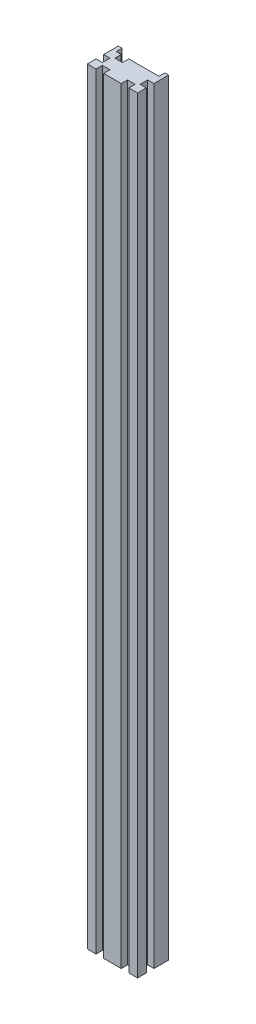
ISO-10303-21;
HEADER;
FILE_DESCRIPTION(('STEP AP214'),'2;1');
FILE_NAME('part.step','',(''),(''),'','','');
FILE_SCHEMA(('AUTOMOTIVE_DESIGN { 1 0 10303 214 1 1 1 1 }'));
ENDSEC;
DATA;
#1=APPLICATION_CONTEXT('core data for automotive mechanical design processes');
#2=APPLICATION_PROTOCOL_DEFINITION('international standard','automotive_design',2000,#1);
#3=PRODUCT_CONTEXT('',#1,'mechanical');
#4=PRODUCT('Part','Part','',(#3));
#5=PRODUCT_RELATED_PRODUCT_CATEGORY('part','',(#4));
#6=PRODUCT_DEFINITION_FORMATION('','',#4);
#7=PRODUCT_DEFINITION_CONTEXT('part definition',#1,'design');
#8=PRODUCT_DEFINITION('design','',#6,#7);
#9=PRODUCT_DEFINITION_SHAPE('','',#8);
#10=(LENGTH_UNIT() NAMED_UNIT(*) SI_UNIT(.MILLI.,.METRE.));
#11=(NAMED_UNIT(*) PLANE_ANGLE_UNIT() SI_UNIT($,.RADIAN.));
#12=(NAMED_UNIT(*) SI_UNIT($,.STERADIAN.) SOLID_ANGLE_UNIT());
#13=UNCERTAINTY_MEASURE_WITH_UNIT(LENGTH_MEASURE(1.E-05),#10,'distance_accuracy_value','');
#14=(GEOMETRIC_REPRESENTATION_CONTEXT(3) GLOBAL_UNCERTAINTY_ASSIGNED_CONTEXT((#13)) GLOBAL_UNIT_ASSIGNED_CONTEXT((#10,
#11,#12)) REPRESENTATION_CONTEXT('',''));
#15=CARTESIAN_POINT('',(0.,0.,0.));
#16=DIRECTION('',(0.,0.,1.));
#17=DIRECTION('',(1.,0.,0.));
#18=AXIS2_PLACEMENT_3D('',#15,#16,#17);
#19=CARTESIAN_POINT('',(0.,609.6,-20.));
#20=DIRECTION('',(0.,0.,1.));
#21=DIRECTION('',(1.,0.,0.));
#22=AXIS2_PLACEMENT_3D('',#19,#20,#21);
#23=PLANE('',#22);
#24=DIRECTION('',(0.,-1.,0.));
#25=VECTOR('',#24,1.);
#26=CARTESIAN_POINT('',(3.,609.6,-20.));
#27=LINE('',#26,#25);
#28=CARTESIAN_POINT('',(3.,609.6,-20.));
#29=VERTEX_POINT('',#28);
#30=CARTESIAN_POINT('',(3.,0.,-20.));
#31=VERTEX_POINT('',#30);
#32=EDGE_CURVE('E61',#29,#31,#27,.T.);
#33=ORIENTED_EDGE('',*,*,#32,.F.);
#34=DIRECTION('',(-1.,0.,0.));
#35=VECTOR('',#34,1.);
#36=CARTESIAN_POINT('',(0.,609.6,-20.));
#37=LINE('',#36,#35);
#38=CARTESIAN_POINT('',(7.,609.6,-20.));
#39=VERTEX_POINT('',#38);
#40=EDGE_CURVE('E486',#39,#29,#37,.T.);
#41=ORIENTED_EDGE('',*,*,#40,.F.);
#42=DIRECTION('',(0.,1.,0.));
#43=VECTOR('',#42,1.);
#44=CARTESIAN_POINT('',(7.,609.6,-20.));
#45=LINE('',#44,#43);
#46=CARTESIAN_POINT('',(6.99999999999993,0.,-20.));
#47=VERTEX_POINT('',#46);
#48=EDGE_CURVE('E297',#47,#39,#45,.T.);
#49=ORIENTED_EDGE('',*,*,#48,.F.);
#50=DIRECTION('',(-1.,0.,0.));
#51=VECTOR('',#50,1.);
#52=CARTESIAN_POINT('',(0.,0.,-20.));
#53=LINE('',#52,#51);
#54=EDGE_CURVE('E66',#47,#31,#53,.T.);
#55=ORIENTED_EDGE('',*,*,#54,.T.);
#56=EDGE_LOOP('',(#33,#41,#49,#55));
#57=FACE_BOUND('',#56,.T.);
#58=ADVANCED_FACE('F45',(#57),#23,.F.);
#59=DIRECTION('',(0.,1.,0.));
#60=VECTOR('',#59,1.);
#61=CARTESIAN_POINT('',(37.,0.,-20.));
#62=LINE('',#61,#60);
#63=CARTESIAN_POINT('',(37.,0.,-20.));
#64=VERTEX_POINT('',#63);
#65=CARTESIAN_POINT('',(37.,609.6,-20.));
#66=VERTEX_POINT('',#65);
#67=EDGE_CURVE('E267',#64,#66,#62,.T.);
#68=ORIENTED_EDGE('',*,*,#67,.F.);
#69=CARTESIAN_POINT('',(12.9999999999999,0.,-20.));
#70=VERTEX_POINT('',#69);
#71=EDGE_CURVE('E500',#64,#70,#53,.T.);
#72=ORIENTED_EDGE('',*,*,#71,.T.);
#73=DIRECTION('',(0.,-1.,0.));
#74=VECTOR('',#73,1.);
#75=CARTESIAN_POINT('',(13.,609.6,-20.));
#76=LINE('',#75,#74);
#77=CARTESIAN_POINT('',(13.,609.6,-20.));
#78=VERTEX_POINT('',#77);
#79=EDGE_CURVE('E303',#78,#70,#76,.T.);
#80=ORIENTED_EDGE('',*,*,#79,.F.);
#81=EDGE_CURVE('E487',#66,#78,#37,.T.);
#82=ORIENTED_EDGE('',*,*,#81,.F.);
#83=EDGE_LOOP('',(#68,#72,#80,#82));
#84=FACE_BOUND('',#83,.T.);
#85=ADVANCED_FACE('F585',(#84),#23,.F.);
#86=CARTESIAN_POINT('',(40.,609.6,0.));
#87=DIRECTION('',(-1.,0.,0.));
#88=DIRECTION('',(0.,0.,1.));
#89=AXIS2_PLACEMENT_3D('',#86,#87,#88);
#90=PLANE('',#89);
#91=DIRECTION('',(0.,0.,-1.));
#92=VECTOR('',#91,1.);
#93=CARTESIAN_POINT('',(40.,0.,0.));
#94=LINE('',#93,#92);
#95=CARTESIAN_POINT('',(40.,0.,0.));
#96=VERTEX_POINT('',#95);
#97=CARTESIAN_POINT('',(40.,0.,-7.00000000000008));
#98=VERTEX_POINT('',#97);
#99=EDGE_CURVE('E496',#96,#98,#94,.T.);
#100=ORIENTED_EDGE('',*,*,#99,.T.);
#101=DIRECTION('',(0.,-1.,0.));
#102=VECTOR('',#101,1.);
#103=CARTESIAN_POINT('',(40.,609.6,-7.));
#104=LINE('',#103,#102);
#105=CARTESIAN_POINT('',(40.,609.6,-7.));
#106=VERTEX_POINT('',#105);
#107=EDGE_CURVE('E323',#106,#98,#104,.T.);
#108=ORIENTED_EDGE('',*,*,#107,.F.);
#109=DIRECTION('',(0.,0.,-1.));
#110=VECTOR('',#109,1.);
#111=CARTESIAN_POINT('',(40.,609.6,0.));
#112=LINE('',#111,#110);
#113=CARTESIAN_POINT('',(40.,609.6,0.));
#114=VERTEX_POINT('',#113);
#115=EDGE_CURVE('E482',#114,#106,#112,.T.);
#116=ORIENTED_EDGE('',*,*,#115,.F.);
#117=DIRECTION('',(0.,-1.,0.));
#118=VECTOR('',#117,1.);
#119=CARTESIAN_POINT('',(40.,609.6,0.));
#120=LINE('',#119,#118);
#121=EDGE_CURVE('E54',#114,#96,#120,.T.);
#122=ORIENTED_EDGE('',*,*,#121,.T.);
#123=EDGE_LOOP('',(#100,#108,#116,#122));
#124=FACE_BOUND('',#123,.T.);
#125=ADVANCED_FACE('F508',(#124),#90,.F.);
#126=CARTESIAN_POINT('',(0.,609.6,0.));
#127=DIRECTION('',(1.,0.,0.));
#128=DIRECTION('',(0.,0.,-1.));
#129=AXIS2_PLACEMENT_3D('',#126,#127,#128);
#130=PLANE('',#129);
#131=DIRECTION('',(0.,0.,1.));
#132=VECTOR('',#131,1.);
#133=CARTESIAN_POINT('',(0.,0.,0.));
#134=LINE('',#133,#132);
#135=CARTESIAN_POINT('',(0.,0.,-24.75));
#136=VERTEX_POINT('',#135);
#137=CARTESIAN_POINT('',(0.,0.,-12.9999999999999));
#138=VERTEX_POINT('',#137);
#139=EDGE_CURVE('E232',#136,#138,#134,.T.);
#140=ORIENTED_EDGE('',*,*,#139,.T.);
#141=DIRECTION('',(0.,-1.,0.));
#142=VECTOR('',#141,1.);
#143=CARTESIAN_POINT('',(0.,609.6,-13.));
#144=LINE('',#143,#142);
#145=CARTESIAN_POINT('',(0.,609.6,-13.));
#146=VERTEX_POINT('',#145);
#147=EDGE_CURVE('E359',#146,#138,#144,.T.);
#148=ORIENTED_EDGE('',*,*,#147,.F.);
#149=DIRECTION('',(0.,0.,1.));
#150=VECTOR('',#149,1.);
#151=CARTESIAN_POINT('',(0.,609.6,0.));
#152=LINE('',#151,#150);
#153=CARTESIAN_POINT('',(0.,609.6,-24.75));
#154=VERTEX_POINT('',#153);
#155=EDGE_CURVE('E260',#154,#146,#152,.T.);
#156=ORIENTED_EDGE('',*,*,#155,.F.);
#157=DIRECTION('',(0.,1.,0.));
#158=VECTOR('',#157,1.);
#159=CARTESIAN_POINT('',(0.,609.6,-24.75));
#160=LINE('',#159,#158);
#161=EDGE_CURVE('E251',#136,#154,#160,.T.);
#162=ORIENTED_EDGE('',*,*,#161,.F.);
#163=EDGE_LOOP('',(#140,#148,#156,#162));
#164=FACE_BOUND('',#163,.T.);
#165=ADVANCED_FACE('F258',(#164),#130,.F.);
#166=CARTESIAN_POINT('',(0.,609.6,0.));
#167=DIRECTION('',(0.,0.,-1.));
#168=DIRECTION('',(-1.,0.,0.));
#169=AXIS2_PLACEMENT_3D('',#166,#167,#168);
#170=PLANE('',#169);
#171=DIRECTION('',(1.,0.,0.));
#172=VECTOR('',#171,1.);
#173=CARTESIAN_POINT('',(0.,0.,0.));
#174=LINE('',#173,#172);
#175=CARTESIAN_POINT('',(0.,0.,0.));
#176=VERTEX_POINT('',#175);
#177=CARTESIAN_POINT('',(7.00000000000007,0.,0.));
#178=VERTEX_POINT('',#177);
#179=EDGE_CURVE('E490',#176,#178,#174,.T.);
#180=ORIENTED_EDGE('',*,*,#179,.T.);
#181=DIRECTION('',(0.,-1.,0.));
#182=VECTOR('',#181,1.);
#183=CARTESIAN_POINT('',(7.,609.6,0.));
#184=LINE('',#183,#182);
#185=CARTESIAN_POINT('',(7.,609.6,0.));
#186=VERTEX_POINT('',#185);
#187=EDGE_CURVE('E420',#186,#178,#184,.T.);
#188=ORIENTED_EDGE('',*,*,#187,.F.);
#189=DIRECTION('',(1.,0.,0.));
#190=VECTOR('',#189,1.);
#191=CARTESIAN_POINT('',(0.,609.6,0.));
#192=LINE('',#191,#190);
#193=CARTESIAN_POINT('',(0.,609.6,0.));
#194=VERTEX_POINT('',#193);
#195=EDGE_CURVE('E476',#194,#186,#192,.T.);
#196=ORIENTED_EDGE('',*,*,#195,.F.);
#197=DIRECTION('',(0.,-1.,0.));
#198=VECTOR('',#197,1.);
#199=CARTESIAN_POINT('',(0.,609.6,0.));
#200=LINE('',#199,#198);
#201=EDGE_CURVE('E11',#194,#176,#200,.T.);
#202=ORIENTED_EDGE('',*,*,#201,.T.);
#203=EDGE_LOOP('',(#180,#188,#196,#202));
#204=FACE_BOUND('',#203,.T.);
#205=ADVANCED_FACE('F562',(#204),#170,.F.);
#206=CARTESIAN_POINT('',(13.,609.6,0.));
#207=VERTEX_POINT('',#206);
#208=CARTESIAN_POINT('',(27.,609.6,0.));
#209=VERTEX_POINT('',#208);
#210=EDGE_CURVE('E481',#207,#209,#192,.T.);
#211=ORIENTED_EDGE('',*,*,#210,.F.);
#212=DIRECTION('',(0.,1.,0.));
#213=VECTOR('',#212,1.);
#214=CARTESIAN_POINT('',(13.,609.6,0.));
#215=LINE('',#214,#213);
#216=CARTESIAN_POINT('',(13.,0.,0.));
#217=VERTEX_POINT('',#216);
#218=EDGE_CURVE('E407',#217,#207,#215,.T.);
#219=ORIENTED_EDGE('',*,*,#218,.F.);
#220=CARTESIAN_POINT('',(27.,0.,0.));
#221=VERTEX_POINT('',#220);
#222=EDGE_CURVE('E495',#217,#221,#174,.T.);
#223=ORIENTED_EDGE('',*,*,#222,.T.);
#224=DIRECTION('',(0.,-1.,0.));
#225=VECTOR('',#224,1.);
#226=CARTESIAN_POINT('',(27.,0.,0.));
#227=LINE('',#226,#225);
#228=EDGE_CURVE('E423',#209,#221,#227,.T.);
#229=ORIENTED_EDGE('',*,*,#228,.F.);
#230=EDGE_LOOP('',(#211,#219,#223,#229));
#231=FACE_BOUND('',#230,.T.);
#232=ADVANCED_FACE('F535',(#231),#170,.F.);
#233=CARTESIAN_POINT('',(0.,609.6,-7.));
#234=VERTEX_POINT('',#233);
#235=EDGE_CURVE('E475',#234,#194,#152,.T.);
#236=ORIENTED_EDGE('',*,*,#235,.F.);
#237=DIRECTION('',(0.,1.,0.));
#238=VECTOR('',#237,1.);
#239=CARTESIAN_POINT('',(0.,609.6,-7.));
#240=LINE('',#239,#238);
#241=CARTESIAN_POINT('',(0.,0.,-6.99999999999993));
#242=VERTEX_POINT('',#241);
#243=EDGE_CURVE('E374',#242,#234,#240,.T.);
#244=ORIENTED_EDGE('',*,*,#243,.F.);
#245=EDGE_CURVE('E246',#242,#176,#134,.T.);
#246=ORIENTED_EDGE('',*,*,#245,.T.);
#247=ORIENTED_EDGE('',*,*,#201,.F.);
#248=EDGE_LOOP('',(#236,#244,#246,#247));
#249=FACE_BOUND('',#248,.T.);
#250=ADVANCED_FACE('F47',(#249),#130,.F.);
#251=CARTESIAN_POINT('',(33.,609.6,0.));
#252=VERTEX_POINT('',#251);
#253=EDGE_CURVE('E474',#252,#114,#192,.T.);
#254=ORIENTED_EDGE('',*,*,#253,.F.);
#255=DIRECTION('',(0.,1.,0.));
#256=VECTOR('',#255,1.);
#257=CARTESIAN_POINT('',(33.,0.,0.));
#258=LINE('',#257,#256);
#259=CARTESIAN_POINT('',(33.,0.,0.));
#260=VERTEX_POINT('',#259);
#261=EDGE_CURVE('E453',#260,#252,#258,.T.);
#262=ORIENTED_EDGE('',*,*,#261,.F.);
#263=EDGE_CURVE('E245',#260,#96,#174,.T.);
#264=ORIENTED_EDGE('',*,*,#263,.T.);
#265=ORIENTED_EDGE('',*,*,#121,.F.);
#266=EDGE_LOOP('',(#254,#262,#264,#265));
#267=FACE_BOUND('',#266,.T.);
#268=ADVANCED_FACE('F547',(#267),#170,.F.);
#269=CARTESIAN_POINT('',(40.,609.6,-13.));
#270=VERTEX_POINT('',#269);
#271=CARTESIAN_POINT('',(40.,609.6,-24.75));
#272=VERTEX_POINT('',#271);
#273=EDGE_CURVE('E480',#270,#272,#112,.T.);
#274=ORIENTED_EDGE('',*,*,#273,.F.);
#275=DIRECTION('',(0.,1.,0.));
#276=VECTOR('',#275,1.);
#277=CARTESIAN_POINT('',(40.,609.6,-13.));
#278=LINE('',#277,#276);
#279=CARTESIAN_POINT('',(40.,0.,-13.0000000000001));
#280=VERTEX_POINT('',#279);
#281=EDGE_CURVE('E339',#280,#270,#278,.T.);
#282=ORIENTED_EDGE('',*,*,#281,.F.);
#283=CARTESIAN_POINT('',(40.,0.,-24.75));
#284=VERTEX_POINT('',#283);
#285=EDGE_CURVE('E494',#280,#284,#94,.T.);
#286=ORIENTED_EDGE('',*,*,#285,.T.);
#287=DIRECTION('',(0.,-1.,0.));
#288=VECTOR('',#287,1.);
#289=CARTESIAN_POINT('',(40.,0.,-24.75));
#290=LINE('',#289,#288);
#291=EDGE_CURVE('E272',#272,#284,#290,.T.);
#292=ORIENTED_EDGE('',*,*,#291,.F.);
#293=EDGE_LOOP('',(#274,#282,#286,#292));
#294=FACE_BOUND('',#293,.T.);
#295=ADVANCED_FACE('F594',(#294),#90,.F.);
#296=CARTESIAN_POINT('',(0.,609.6,0.));
#297=DIRECTION('',(0.,-1.,0.));
#298=DIRECTION('',(0.,0.,-1.));
#299=AXIS2_PLACEMENT_3D('',#296,#297,#298);
#300=PLANE('',#299);
#301=DIRECTION('',(1.,0.,0.));
#302=VECTOR('',#301,1.);
#303=CARTESIAN_POINT('',(7.,609.6,-15.));
#304=LINE('',#303,#302);
#305=CARTESIAN_POINT('',(7.,609.6,-15.));
#306=VERTEX_POINT('',#305);
#307=CARTESIAN_POINT('',(13.,609.6,-15.));
#308=VERTEX_POINT('',#307);
#309=EDGE_CURVE('E302',#306,#308,#304,.T.);
#310=ORIENTED_EDGE('',*,*,#309,.F.);
#311=DIRECTION('',(0.,0.,-1.));
#312=VECTOR('',#311,1.);
#313=CARTESIAN_POINT('',(7.,609.6,-15.));
#314=LINE('',#313,#312);
#315=EDGE_CURVE('E314',#306,#39,#314,.T.);
#316=ORIENTED_EDGE('',*,*,#315,.T.);
#317=ORIENTED_EDGE('',*,*,#40,.T.);
#318=DIRECTION('',(0.,0.,1.));
#319=VECTOR('',#318,1.);
#320=CARTESIAN_POINT('',(3.,609.6,-24.75));
#321=LINE('',#320,#319);
#322=CARTESIAN_POINT('',(3.,609.6,-24.75));
#323=VERTEX_POINT('',#322);
#324=EDGE_CURVE('E974',#323,#29,#321,.T.);
#325=ORIENTED_EDGE('',*,*,#324,.F.);
#326=DIRECTION('',(1.,0.,0.));
#327=VECTOR('',#326,1.);
#328=CARTESIAN_POINT('',(0.,609.6,-24.75));
#329=LINE('',#328,#327);
#330=EDGE_CURVE('E263',#154,#323,#329,.T.);
#331=ORIENTED_EDGE('',*,*,#330,.F.);
#332=ORIENTED_EDGE('',*,*,#155,.T.);
#333=DIRECTION('',(-1.,0.,0.));
#334=VECTOR('',#333,1.);
#335=CARTESIAN_POINT('',(5.,609.6,-13.));
#336=LINE('',#335,#334);
#337=CARTESIAN_POINT('',(5.,609.6,-13.));
#338=VERTEX_POINT('',#337);
#339=EDGE_CURVE('E390',#338,#146,#336,.T.);
#340=ORIENTED_EDGE('',*,*,#339,.F.);
#341=DIRECTION('',(0.,0.,-1.));
#342=VECTOR('',#341,1.);
#343=CARTESIAN_POINT('',(5.,609.6,-13.));
#344=LINE('',#343,#342);
#345=CARTESIAN_POINT('',(5.,609.6,-7.));
#346=VERTEX_POINT('',#345);
#347=EDGE_CURVE('E382',#346,#338,#344,.T.);
#348=ORIENTED_EDGE('',*,*,#347,.F.);
#349=DIRECTION('',(-1.,0.,0.));
#350=VECTOR('',#349,1.);
#351=CARTESIAN_POINT('',(5.,609.6,-7.));
#352=LINE('',#351,#350);
#353=EDGE_CURVE('E394',#346,#234,#352,.T.);
#354=ORIENTED_EDGE('',*,*,#353,.T.);
#355=ORIENTED_EDGE('',*,*,#235,.T.);
#356=ORIENTED_EDGE('',*,*,#195,.T.);
#357=DIRECTION('',(0.,0.,1.));
#358=VECTOR('',#357,1.);
#359=CARTESIAN_POINT('',(7.,609.6,-5.));
#360=LINE('',#359,#358);
#361=CARTESIAN_POINT('',(7.,609.6,-5.));
#362=VERTEX_POINT('',#361);
#363=EDGE_CURVE('E426',#362,#186,#360,.T.);
#364=ORIENTED_EDGE('',*,*,#363,.F.);
#365=DIRECTION('',(-1.,0.,0.));
#366=VECTOR('',#365,1.);
#367=CARTESIAN_POINT('',(7.,609.6,-5.));
#368=LINE('',#367,#366);
#369=CARTESIAN_POINT('',(13.,609.6,-5.));
#370=VERTEX_POINT('',#369);
#371=EDGE_CURVE('E415',#370,#362,#368,.T.);
#372=ORIENTED_EDGE('',*,*,#371,.F.);
#373=DIRECTION('',(0.,0.,1.));
#374=VECTOR('',#373,1.);
#375=CARTESIAN_POINT('',(13.,609.6,-5.));
#376=LINE('',#375,#374);
#377=EDGE_CURVE('E429',#370,#207,#376,.T.);
#378=ORIENTED_EDGE('',*,*,#377,.T.);
#379=ORIENTED_EDGE('',*,*,#210,.T.);
#380=DIRECTION('',(0.,0.,1.));
#381=VECTOR('',#380,1.);
#382=CARTESIAN_POINT('',(27.,609.6,-5.));
#383=LINE('',#382,#381);
#384=CARTESIAN_POINT('',(27.,609.6,-5.));
#385=VERTEX_POINT('',#384);
#386=EDGE_CURVE('E393',#385,#209,#383,.T.);
#387=ORIENTED_EDGE('',*,*,#386,.F.);
#388=DIRECTION('',(-1.,0.,0.));
#389=VECTOR('',#388,1.);
#390=CARTESIAN_POINT('',(27.,609.6,-5.));
#391=LINE('',#390,#389);
#392=CARTESIAN_POINT('',(33.,609.6,-5.));
#393=VERTEX_POINT('',#392);
#394=EDGE_CURVE('E443',#393,#385,#391,.T.);
#395=ORIENTED_EDGE('',*,*,#394,.F.);
#396=DIRECTION('',(0.,0.,1.));
#397=VECTOR('',#396,1.);
#398=CARTESIAN_POINT('',(33.,609.6,-5.));
#399=LINE('',#398,#397);
#400=EDGE_CURVE('E447',#393,#252,#399,.T.);
#401=ORIENTED_EDGE('',*,*,#400,.T.);
#402=ORIENTED_EDGE('',*,*,#253,.T.);
#403=ORIENTED_EDGE('',*,*,#115,.T.);
#404=DIRECTION('',(1.,0.,0.));
#405=VECTOR('',#404,1.);
#406=CARTESIAN_POINT('',(35.,609.6,-7.));
#407=LINE('',#406,#405);
#408=CARTESIAN_POINT('',(35.,609.6,-7.));
#409=VERTEX_POINT('',#408);
#410=EDGE_CURVE('E356',#409,#106,#407,.T.);
#411=ORIENTED_EDGE('',*,*,#410,.F.);
#412=DIRECTION('',(0.,0.,1.));
#413=VECTOR('',#412,1.);
#414=CARTESIAN_POINT('',(35.,609.6,-7.));
#415=LINE('',#414,#413);
#416=CARTESIAN_POINT('',(35.,609.6,-13.));
#417=VERTEX_POINT('',#416);
#418=EDGE_CURVE('E347',#417,#409,#415,.T.);
#419=ORIENTED_EDGE('',*,*,#418,.F.);
#420=DIRECTION('',(1.,0.,0.));
#421=VECTOR('',#420,1.);
#422=CARTESIAN_POINT('',(35.,609.6,-13.));
#423=LINE('',#422,#421);
#424=EDGE_CURVE('E360',#417,#270,#423,.T.);
#425=ORIENTED_EDGE('',*,*,#424,.T.);
#426=ORIENTED_EDGE('',*,*,#273,.T.);
#427=DIRECTION('',(1.,0.,0.));
#428=VECTOR('',#427,1.);
#429=CARTESIAN_POINT('',(40.,609.6,-24.75));
#430=LINE('',#429,#428);
#431=CARTESIAN_POINT('',(37.,609.6,-24.75));
#432=VERTEX_POINT('',#431);
#433=EDGE_CURVE('E282',#432,#272,#430,.T.);
#434=ORIENTED_EDGE('',*,*,#433,.F.);
#435=DIRECTION('',(0.,0.,1.));
#436=VECTOR('',#435,1.);
#437=CARTESIAN_POINT('',(37.,609.6,-24.75));
#438=LINE('',#437,#436);
#439=EDGE_CURVE('E286',#432,#66,#438,.T.);
#440=ORIENTED_EDGE('',*,*,#439,.T.);
#441=ORIENTED_EDGE('',*,*,#81,.T.);
#442=DIRECTION('',(0.,0.,-1.));
#443=VECTOR('',#442,1.);
#444=CARTESIAN_POINT('',(13.,609.6,-15.));
#445=LINE('',#444,#443);
#446=EDGE_CURVE('E328',#308,#78,#445,.T.);
#447=ORIENTED_EDGE('',*,*,#446,.F.);
#448=EDGE_LOOP('',(#310,#316,#317,#325,#331,#332,#340,#348,#354,#355,#356,#364,#372,#378,#379,
#387,#395,#401,#402,#403,#411,#419,#425,#426,#434,#440,#441,#447));
#449=FACE_BOUND('',#448,.T.);
#450=ADVANCED_FACE('F522',(#449),#300,.F.);
#451=CARTESIAN_POINT('',(0.,0.,0.));
#452=DIRECTION('',(0.,-1.,0.));
#453=DIRECTION('',(0.,0.,-1.));
#454=AXIS2_PLACEMENT_3D('',#451,#452,#453);
#455=PLANE('',#454);
#456=DIRECTION('',(0.,0.,-1.));
#457=VECTOR('',#456,1.);
#458=CARTESIAN_POINT('',(6.99999999999993,0.,-15.));
#459=LINE('',#458,#457);
#460=CARTESIAN_POINT('',(6.99999999999993,0.,-15.));
#461=VERTEX_POINT('',#460);
#462=EDGE_CURVE('E320',#461,#47,#459,.T.);
#463=ORIENTED_EDGE('',*,*,#462,.F.);
#464=DIRECTION('',(-1.,0.,0.));
#465=VECTOR('',#464,1.);
#466=CARTESIAN_POINT('',(6.99999999999993,0.,-15.));
#467=LINE('',#466,#465);
#468=CARTESIAN_POINT('',(13.,0.,-15.));
#469=VERTEX_POINT('',#468);
#470=EDGE_CURVE('E310',#469,#461,#467,.T.);
#471=ORIENTED_EDGE('',*,*,#470,.F.);
#472=DIRECTION('',(0.,0.,-1.));
#473=VECTOR('',#472,1.);
#474=CARTESIAN_POINT('',(12.9999999999999,0.,-15.));
#475=LINE('',#474,#473);
#476=EDGE_CURVE('E324',#469,#70,#475,.T.);
#477=ORIENTED_EDGE('',*,*,#476,.T.);
#478=ORIENTED_EDGE('',*,*,#71,.F.);
#479=DIRECTION('',(0.,0.,1.));
#480=VECTOR('',#479,1.);
#481=CARTESIAN_POINT('',(37.,0.,-24.75));
#482=LINE('',#481,#480);
#483=CARTESIAN_POINT('',(37.,0.,-24.75));
#484=VERTEX_POINT('',#483);
#485=EDGE_CURVE('E293',#484,#64,#482,.T.);
#486=ORIENTED_EDGE('',*,*,#485,.F.);
#487=DIRECTION('',(-1.,0.,0.));
#488=VECTOR('',#487,1.);
#489=CARTESIAN_POINT('',(40.,0.,-24.75));
#490=LINE('',#489,#488);
#491=EDGE_CURVE('E276',#284,#484,#490,.T.);
#492=ORIENTED_EDGE('',*,*,#491,.F.);
#493=ORIENTED_EDGE('',*,*,#285,.F.);
#494=DIRECTION('',(1.,0.,0.));
#495=VECTOR('',#494,1.);
#496=CARTESIAN_POINT('',(35.,0.,-13.0000000000001));
#497=LINE('',#496,#495);
#498=CARTESIAN_POINT('',(35.,0.,-13.0000000000001));
#499=VERTEX_POINT('',#498);
#500=EDGE_CURVE('E364',#499,#280,#497,.T.);
#501=ORIENTED_EDGE('',*,*,#500,.F.);
#502=DIRECTION('',(0.,0.,-1.));
#503=VECTOR('',#502,1.);
#504=CARTESIAN_POINT('',(35.,0.,-7.00000000000008));
#505=LINE('',#504,#503);
#506=CARTESIAN_POINT('',(35.,0.,-7.));
#507=VERTEX_POINT('',#506);
#508=EDGE_CURVE('E338',#507,#499,#505,.T.);
#509=ORIENTED_EDGE('',*,*,#508,.F.);
#510=DIRECTION('',(1.,0.,0.));
#511=VECTOR('',#510,1.);
#512=CARTESIAN_POINT('',(35.,0.,-7.00000000000008));
#513=LINE('',#512,#511);
#514=EDGE_CURVE('E351',#507,#98,#513,.T.);
#515=ORIENTED_EDGE('',*,*,#514,.T.);
#516=ORIENTED_EDGE('',*,*,#99,.F.);
#517=ORIENTED_EDGE('',*,*,#263,.F.);
#518=DIRECTION('',(0.,0.,1.));
#519=VECTOR('',#518,1.);
#520=CARTESIAN_POINT('',(33.,0.,-5.));
#521=LINE('',#520,#519);
#522=CARTESIAN_POINT('',(33.,0.,-5.));
#523=VERTEX_POINT('',#522);
#524=EDGE_CURVE('E444',#523,#260,#521,.T.);
#525=ORIENTED_EDGE('',*,*,#524,.F.);
#526=DIRECTION('',(1.,0.,0.));
#527=VECTOR('',#526,1.);
#528=CARTESIAN_POINT('',(27.,0.,-5.));
#529=LINE('',#528,#527);
#530=CARTESIAN_POINT('',(27.,0.,-5.));
#531=VERTEX_POINT('',#530);
#532=EDGE_CURVE('E466',#531,#523,#529,.T.);
#533=ORIENTED_EDGE('',*,*,#532,.F.);
#534=DIRECTION('',(0.,0.,1.));
#535=VECTOR('',#534,1.);
#536=CARTESIAN_POINT('',(27.,0.,-5.));
#537=LINE('',#536,#535);
#538=EDGE_CURVE('E439',#531,#221,#537,.T.);
#539=ORIENTED_EDGE('',*,*,#538,.T.);
#540=ORIENTED_EDGE('',*,*,#222,.F.);
#541=DIRECTION('',(0.,0.,1.));
#542=VECTOR('',#541,1.);
#543=CARTESIAN_POINT('',(13.,0.,-5.));
#544=LINE('',#543,#542);
#545=CARTESIAN_POINT('',(13.,0.,-5.));
#546=VERTEX_POINT('',#545);
#547=EDGE_CURVE('E433',#546,#217,#544,.T.);
#548=ORIENTED_EDGE('',*,*,#547,.F.);
#549=DIRECTION('',(1.,0.,0.));
#550=VECTOR('',#549,1.);
#551=CARTESIAN_POINT('',(7.00000000000007,0.,-5.));
#552=LINE('',#551,#550);
#553=CARTESIAN_POINT('',(7.,0.,-5.));
#554=VERTEX_POINT('',#553);
#555=EDGE_CURVE('E406',#554,#546,#552,.T.);
#556=ORIENTED_EDGE('',*,*,#555,.F.);
#557=DIRECTION('',(0.,0.,1.));
#558=VECTOR('',#557,1.);
#559=CARTESIAN_POINT('',(7.00000000000007,0.,-5.));
#560=LINE('',#559,#558);
#561=EDGE_CURVE('E419',#554,#178,#560,.T.);
#562=ORIENTED_EDGE('',*,*,#561,.T.);
#563=ORIENTED_EDGE('',*,*,#179,.F.);
#564=ORIENTED_EDGE('',*,*,#245,.F.);
#565=DIRECTION('',(-1.,0.,0.));
#566=VECTOR('',#565,1.);
#567=CARTESIAN_POINT('',(5.,0.,-6.99999999999993));
#568=LINE('',#567,#566);
#569=CARTESIAN_POINT('',(5.,0.,-6.99999999999993));
#570=VERTEX_POINT('',#569);
#571=EDGE_CURVE('E398',#570,#242,#568,.T.);
#572=ORIENTED_EDGE('',*,*,#571,.F.);
#573=DIRECTION('',(0.,0.,1.));
#574=VECTOR('',#573,1.);
#575=CARTESIAN_POINT('',(5.,0.,-12.9999999999999));
#576=LINE('',#575,#574);
#577=CARTESIAN_POINT('',(5.,0.,-13.));
#578=VERTEX_POINT('',#577);
#579=EDGE_CURVE('E373',#578,#570,#576,.T.);
#580=ORIENTED_EDGE('',*,*,#579,.F.);
#581=DIRECTION('',(-1.,0.,0.));
#582=VECTOR('',#581,1.);
#583=CARTESIAN_POINT('',(5.,0.,-12.9999999999999));
#584=LINE('',#583,#582);
#585=EDGE_CURVE('E240',#578,#138,#584,.T.);
#586=ORIENTED_EDGE('',*,*,#585,.T.);
#587=ORIENTED_EDGE('',*,*,#139,.F.);
#588=DIRECTION('',(-1.,0.,0.));
#589=VECTOR('',#588,1.);
#590=CARTESIAN_POINT('',(0.,0.,-24.75));
#591=LINE('',#590,#589);
#592=CARTESIAN_POINT('',(2.99999999999993,0.,-24.75));
#593=VERTEX_POINT('',#592);
#594=EDGE_CURVE('E237',#593,#136,#591,.T.);
#595=ORIENTED_EDGE('',*,*,#594,.F.);
#596=DIRECTION('',(0.,0.,1.));
#597=VECTOR('',#596,1.);
#598=CARTESIAN_POINT('',(2.99999999999993,0.,-24.75));
#599=LINE('',#598,#597);
#600=EDGE_CURVE('E256',#593,#31,#599,.T.);
#601=ORIENTED_EDGE('',*,*,#600,.T.);
#602=ORIENTED_EDGE('',*,*,#54,.F.);
#603=EDGE_LOOP('',(#463,#471,#477,#478,#486,#492,#493,#501,#509,#515,#516,#517,#525,#533,#539,
#540,#548,#556,#562,#563,#564,#572,#580,#586,#587,#595,#601,#602));
#604=FACE_BOUND('',#603,.T.);
#605=ADVANCED_FACE('F235',(#604),#455,.T.);
#606=CARTESIAN_POINT('',(27.,0.,-5.));
#607=DIRECTION('',(-1.,0.,0.));
#608=DIRECTION('',(0.,0.,1.));
#609=AXIS2_PLACEMENT_3D('',#606,#607,#608);
#610=PLANE('',#609);
#611=ORIENTED_EDGE('',*,*,#228,.T.);
#612=ORIENTED_EDGE('',*,*,#538,.F.);
#613=DIRECTION('',(0.,-1.,0.));
#614=VECTOR('',#613,1.);
#615=CARTESIAN_POINT('',(27.,0.,-5.));
#616=LINE('',#615,#614);
#617=EDGE_CURVE('E456',#385,#531,#616,.T.);
#618=ORIENTED_EDGE('',*,*,#617,.F.);
#619=ORIENTED_EDGE('',*,*,#386,.T.);
#620=EDGE_LOOP('',(#611,#612,#618,#619));
#621=FACE_BOUND('',#620,.T.);
#622=ADVANCED_FACE('F540',(#621),#610,.F.);
#623=CARTESIAN_POINT('',(33.,0.,-5.));
#624=DIRECTION('',(1.,0.,0.));
#625=DIRECTION('',(0.,0.,-1.));
#626=AXIS2_PLACEMENT_3D('',#623,#624,#625);
#627=PLANE('',#626);
#628=ORIENTED_EDGE('',*,*,#261,.T.);
#629=ORIENTED_EDGE('',*,*,#400,.F.);
#630=DIRECTION('',(0.,1.,0.));
#631=VECTOR('',#630,1.);
#632=CARTESIAN_POINT('',(33.,0.,-5.));
#633=LINE('',#632,#631);
#634=EDGE_CURVE('E462',#523,#393,#633,.T.);
#635=ORIENTED_EDGE('',*,*,#634,.F.);
#636=ORIENTED_EDGE('',*,*,#524,.T.);
#637=EDGE_LOOP('',(#628,#629,#635,#636));
#638=FACE_BOUND('',#637,.T.);
#639=ADVANCED_FACE('F546',(#638),#627,.F.);
#640=CARTESIAN_POINT('',(0.,0.,-5.));
#641=DIRECTION('',(0.,0.,-1.));
#642=DIRECTION('',(-1.,0.,0.));
#643=AXIS2_PLACEMENT_3D('',#640,#641,#642);
#644=PLANE('',#643);
#645=ORIENTED_EDGE('',*,*,#617,.T.);
#646=ORIENTED_EDGE('',*,*,#532,.T.);
#647=ORIENTED_EDGE('',*,*,#634,.T.);
#648=ORIENTED_EDGE('',*,*,#394,.T.);
#649=EDGE_LOOP('',(#645,#646,#647,#648));
#650=FACE_BOUND('',#649,.T.);
#651=ADVANCED_FACE('F544',(#650),#644,.F.);
#652=CARTESIAN_POINT('',(7.,609.6,-5.));
#653=DIRECTION('',(-1.,0.,0.));
#654=DIRECTION('',(0.,-1.,0.));
#655=AXIS2_PLACEMENT_3D('',#652,#653,#654);
#656=PLANE('',#655);
#657=ORIENTED_EDGE('',*,*,#187,.T.);
#658=ORIENTED_EDGE('',*,*,#561,.F.);
#659=DIRECTION('',(0.,-1.,0.));
#660=VECTOR('',#659,1.);
#661=CARTESIAN_POINT('',(7.,609.6,-5.));
#662=LINE('',#661,#660);
#663=EDGE_CURVE('E403',#362,#554,#662,.T.);
#664=ORIENTED_EDGE('',*,*,#663,.F.);
#665=ORIENTED_EDGE('',*,*,#363,.T.);
#666=EDGE_LOOP('',(#657,#658,#664,#665));
#667=FACE_BOUND('',#666,.T.);
#668=ADVANCED_FACE('F570',(#667),#656,.F.);
#669=CARTESIAN_POINT('',(13.,609.6,-5.));
#670=DIRECTION('',(1.,0.,0.));
#671=DIRECTION('',(0.,0.,-1.));
#672=AXIS2_PLACEMENT_3D('',#669,#670,#671);
#673=PLANE('',#672);
#674=ORIENTED_EDGE('',*,*,#218,.T.);
#675=ORIENTED_EDGE('',*,*,#377,.F.);
#676=DIRECTION('',(0.,1.,0.));
#677=VECTOR('',#676,1.);
#678=CARTESIAN_POINT('',(13.,609.6,-5.));
#679=LINE('',#678,#677);
#680=EDGE_CURVE('E411',#546,#370,#679,.T.);
#681=ORIENTED_EDGE('',*,*,#680,.F.);
#682=ORIENTED_EDGE('',*,*,#547,.T.);
#683=EDGE_LOOP('',(#674,#675,#681,#682));
#684=FACE_BOUND('',#683,.T.);
#685=ADVANCED_FACE('F574',(#684),#673,.F.);
#686=CARTESIAN_POINT('',(0.,0.,-5.));
#687=DIRECTION('',(0.,0.,1.));
#688=DIRECTION('',(1.,0.,0.));
#689=AXIS2_PLACEMENT_3D('',#686,#687,#688);
#690=PLANE('',#689);
#691=ORIENTED_EDGE('',*,*,#663,.T.);
#692=ORIENTED_EDGE('',*,*,#555,.T.);
#693=ORIENTED_EDGE('',*,*,#680,.T.);
#694=ORIENTED_EDGE('',*,*,#371,.T.);
#695=EDGE_LOOP('',(#691,#692,#693,#694));
#696=FACE_BOUND('',#695,.T.);
#697=ADVANCED_FACE('F572',(#696),#690,.T.);
#698=CARTESIAN_POINT('',(5.,609.6,-13.));
#699=DIRECTION('',(0.,0.,-1.));
#700=DIRECTION('',(0.,1.,0.));
#701=AXIS2_PLACEMENT_3D('',#698,#699,#700);
#702=PLANE('',#701);
#703=ORIENTED_EDGE('',*,*,#147,.T.);
#704=ORIENTED_EDGE('',*,*,#585,.F.);
#705=DIRECTION('',(0.,-1.,0.));
#706=VECTOR('',#705,1.);
#707=CARTESIAN_POINT('',(5.,609.6,-13.));
#708=LINE('',#707,#706);
#709=EDGE_CURVE('E370',#338,#578,#708,.T.);
#710=ORIENTED_EDGE('',*,*,#709,.F.);
#711=ORIENTED_EDGE('',*,*,#339,.T.);
#712=EDGE_LOOP('',(#703,#704,#710,#711));
#713=FACE_BOUND('',#712,.T.);
#714=ADVANCED_FACE('F581',(#713),#702,.F.);
#715=CARTESIAN_POINT('',(5.,609.6,-7.));
#716=DIRECTION('',(0.,0.,1.));
#717=DIRECTION('',(0.,-1.,0.));
#718=AXIS2_PLACEMENT_3D('',#715,#716,#717);
#719=PLANE('',#718);
#720=ORIENTED_EDGE('',*,*,#243,.T.);
#721=ORIENTED_EDGE('',*,*,#353,.F.);
#722=DIRECTION('',(0.,1.,0.));
#723=VECTOR('',#722,1.);
#724=CARTESIAN_POINT('',(5.,609.6,-7.));
#725=LINE('',#724,#723);
#726=EDGE_CURVE('E378',#570,#346,#725,.T.);
#727=ORIENTED_EDGE('',*,*,#726,.F.);
#728=ORIENTED_EDGE('',*,*,#571,.T.);
#729=EDGE_LOOP('',(#720,#721,#727,#728));
#730=FACE_BOUND('',#729,.T.);
#731=ADVANCED_FACE('F687',(#730),#719,.F.);
#732=CARTESIAN_POINT('',(5.,0.,0.));
#733=DIRECTION('',(-1.,0.,0.));
#734=DIRECTION('',(0.,0.,1.));
#735=AXIS2_PLACEMENT_3D('',#732,#733,#734);
#736=PLANE('',#735);
#737=ORIENTED_EDGE('',*,*,#709,.T.);
#738=ORIENTED_EDGE('',*,*,#579,.T.);
#739=ORIENTED_EDGE('',*,*,#726,.T.);
#740=ORIENTED_EDGE('',*,*,#347,.T.);
#741=EDGE_LOOP('',(#737,#738,#739,#740));
#742=FACE_BOUND('',#741,.T.);
#743=ADVANCED_FACE('F697',(#742),#736,.T.);
#744=CARTESIAN_POINT('',(35.,609.6,-7.));
#745=DIRECTION('',(0.,0.,1.));
#746=DIRECTION('',(0.,-1.,0.));
#747=AXIS2_PLACEMENT_3D('',#744,#745,#746);
#748=PLANE('',#747);
#749=ORIENTED_EDGE('',*,*,#107,.T.);
#750=ORIENTED_EDGE('',*,*,#514,.F.);
#751=DIRECTION('',(0.,-1.,0.));
#752=VECTOR('',#751,1.);
#753=CARTESIAN_POINT('',(35.,609.6,-7.));
#754=LINE('',#753,#752);
#755=EDGE_CURVE('E335',#409,#507,#754,.T.);
#756=ORIENTED_EDGE('',*,*,#755,.F.);
#757=ORIENTED_EDGE('',*,*,#410,.T.);
#758=EDGE_LOOP('',(#749,#750,#756,#757));
#759=FACE_BOUND('',#758,.T.);
#760=ADVANCED_FACE('F518',(#759),#748,.F.);
#761=CARTESIAN_POINT('',(35.,609.6,-13.));
#762=DIRECTION('',(0.,0.,-1.));
#763=DIRECTION('',(0.,1.,0.));
#764=AXIS2_PLACEMENT_3D('',#761,#762,#763);
#765=PLANE('',#764);
#766=ORIENTED_EDGE('',*,*,#281,.T.);
#767=ORIENTED_EDGE('',*,*,#424,.F.);
#768=DIRECTION('',(0.,1.,0.));
#769=VECTOR('',#768,1.);
#770=CARTESIAN_POINT('',(35.,609.6,-13.));
#771=LINE('',#770,#769);
#772=EDGE_CURVE('E343',#499,#417,#771,.T.);
#773=ORIENTED_EDGE('',*,*,#772,.F.);
#774=ORIENTED_EDGE('',*,*,#500,.T.);
#775=EDGE_LOOP('',(#766,#767,#773,#774));
#776=FACE_BOUND('',#775,.T.);
#777=ADVANCED_FACE('F717',(#776),#765,.F.);
#778=CARTESIAN_POINT('',(35.,0.,0.));
#779=DIRECTION('',(1.,0.,0.));
#780=DIRECTION('',(0.,0.,-1.));
#781=AXIS2_PLACEMENT_3D('',#778,#779,#780);
#782=PLANE('',#781);
#783=ORIENTED_EDGE('',*,*,#755,.T.);
#784=ORIENTED_EDGE('',*,*,#508,.T.);
#785=ORIENTED_EDGE('',*,*,#772,.T.);
#786=ORIENTED_EDGE('',*,*,#418,.T.);
#787=EDGE_LOOP('',(#783,#784,#785,#786));
#788=FACE_BOUND('',#787,.T.);
#789=ADVANCED_FACE('F726',(#788),#782,.T.);
#790=CARTESIAN_POINT('',(7.,609.6,-15.));
#791=DIRECTION('',(-1.,0.,0.));
#792=DIRECTION('',(0.,-1.,0.));
#793=AXIS2_PLACEMENT_3D('',#790,#791,#792);
#794=PLANE('',#793);
#795=ORIENTED_EDGE('',*,*,#48,.T.);
#796=ORIENTED_EDGE('',*,*,#315,.F.);
#797=DIRECTION('',(0.,1.,0.));
#798=VECTOR('',#797,1.);
#799=CARTESIAN_POINT('',(7.,609.6,-15.));
#800=LINE('',#799,#798);
#801=EDGE_CURVE('E298',#461,#306,#800,.T.);
#802=ORIENTED_EDGE('',*,*,#801,.F.);
#803=ORIENTED_EDGE('',*,*,#462,.T.);
#804=EDGE_LOOP('',(#795,#796,#802,#803));
#805=FACE_BOUND('',#804,.T.);
#806=ADVANCED_FACE('F736',(#805),#794,.F.);
#807=CARTESIAN_POINT('',(13.,609.6,-15.));
#808=DIRECTION('',(1.,0.,0.));
#809=DIRECTION('',(0.,1.,0.));
#810=AXIS2_PLACEMENT_3D('',#807,#808,#809);
#811=PLANE('',#810);
#812=ORIENTED_EDGE('',*,*,#79,.T.);
#813=ORIENTED_EDGE('',*,*,#476,.F.);
#814=DIRECTION('',(0.,-1.,0.));
#815=VECTOR('',#814,1.);
#816=CARTESIAN_POINT('',(13.,609.6,-15.));
#817=LINE('',#816,#815);
#818=EDGE_CURVE('E307',#308,#469,#817,.T.);
#819=ORIENTED_EDGE('',*,*,#818,.F.);
#820=ORIENTED_EDGE('',*,*,#446,.T.);
#821=EDGE_LOOP('',(#812,#813,#819,#820));
#822=FACE_BOUND('',#821,.T.);
#823=ADVANCED_FACE('F746',(#822),#811,.F.);
#824=CARTESIAN_POINT('',(0.,0.,-15.));
#825=DIRECTION('',(0.,0.,1.));
#826=DIRECTION('',(1.,0.,0.));
#827=AXIS2_PLACEMENT_3D('',#824,#825,#826);
#828=PLANE('',#827);
#829=ORIENTED_EDGE('',*,*,#801,.T.);
#830=ORIENTED_EDGE('',*,*,#309,.T.);
#831=ORIENTED_EDGE('',*,*,#818,.T.);
#832=ORIENTED_EDGE('',*,*,#470,.T.);
#833=EDGE_LOOP('',(#829,#830,#831,#832));
#834=FACE_BOUND('',#833,.T.);
#835=ADVANCED_FACE('F756',(#834),#828,.F.);
#836=CARTESIAN_POINT('',(37.,0.,-24.75));
#837=DIRECTION('',(1.,0.,0.));
#838=DIRECTION('',(0.,0.,-1.));
#839=AXIS2_PLACEMENT_3D('',#836,#837,#838);
#840=PLANE('',#839);
#841=ORIENTED_EDGE('',*,*,#67,.T.);
#842=ORIENTED_EDGE('',*,*,#439,.F.);
#843=DIRECTION('',(0.,1.,0.));
#844=VECTOR('',#843,1.);
#845=CARTESIAN_POINT('',(37.,0.,-24.75));
#846=LINE('',#845,#844);
#847=EDGE_CURVE('E279',#484,#432,#846,.T.);
#848=ORIENTED_EDGE('',*,*,#847,.F.);
#849=ORIENTED_EDGE('',*,*,#485,.T.);
#850=EDGE_LOOP('',(#841,#842,#848,#849));
#851=FACE_BOUND('',#850,.T.);
#852=ADVANCED_FACE('F766',(#851),#840,.F.);
#853=CARTESIAN_POINT('',(0.,0.,-24.75));
#854=DIRECTION('',(0.,0.,1.));
#855=DIRECTION('',(1.,0.,0.));
#856=AXIS2_PLACEMENT_3D('',#853,#854,#855);
#857=PLANE('',#856);
#858=ORIENTED_EDGE('',*,*,#291,.T.);
#859=ORIENTED_EDGE('',*,*,#491,.T.);
#860=ORIENTED_EDGE('',*,*,#847,.T.);
#861=ORIENTED_EDGE('',*,*,#433,.T.);
#862=EDGE_LOOP('',(#858,#859,#860,#861));
#863=FACE_BOUND('',#862,.T.);
#864=ADVANCED_FACE('F776',(#863),#857,.F.);
#865=CARTESIAN_POINT('',(3.,609.6,-24.75));
#866=DIRECTION('',(-1.,0.,0.));
#867=DIRECTION('',(0.,-1.,0.));
#868=AXIS2_PLACEMENT_3D('',#865,#866,#867);
#869=PLANE('',#868);
#870=ORIENTED_EDGE('',*,*,#32,.T.);
#871=ORIENTED_EDGE('',*,*,#600,.F.);
#872=DIRECTION('',(0.,-1.,0.));
#873=VECTOR('',#872,1.);
#874=CARTESIAN_POINT('',(3.,609.6,-24.75));
#875=LINE('',#874,#873);
#876=EDGE_CURVE('E253',#323,#593,#875,.T.);
#877=ORIENTED_EDGE('',*,*,#876,.F.);
#878=ORIENTED_EDGE('',*,*,#324,.T.);
#879=EDGE_LOOP('',(#870,#871,#877,#878));
#880=FACE_BOUND('',#879,.T.);
#881=ADVANCED_FACE('F786',(#880),#869,.F.);
#882=CARTESIAN_POINT('',(0.,0.,-24.75));
#883=DIRECTION('',(0.,0.,1.));
#884=DIRECTION('',(1.,0.,0.));
#885=AXIS2_PLACEMENT_3D('',#882,#883,#884);
#886=PLANE('',#885);
#887=ORIENTED_EDGE('',*,*,#161,.T.);
#888=ORIENTED_EDGE('',*,*,#330,.T.);
#889=ORIENTED_EDGE('',*,*,#876,.T.);
#890=ORIENTED_EDGE('',*,*,#594,.T.);
#891=EDGE_LOOP('',(#887,#888,#889,#890));
#892=FACE_BOUND('',#891,.T.);
#893=ADVANCED_FACE('F250',(#892),#886,.F.);
#894=CLOSED_SHELL('',(#58,#85,#125,#165,#205,#232,#250,#268,#295,#450,#605,#622,#639,#651,#668,
#685,#697,#714,#731,#743,#760,#777,#789,#806,#823,#835,#852,#864,#881,#893));
#895=MANIFOLD_SOLID_BREP('B2',#894);
#896=ADVANCED_BREP_SHAPE_REPRESENTATION('',(#18,#895),#14);
#897=SHAPE_DEFINITION_REPRESENTATION(#9,#896);
ENDSEC;
END-ISO-10303-21;
